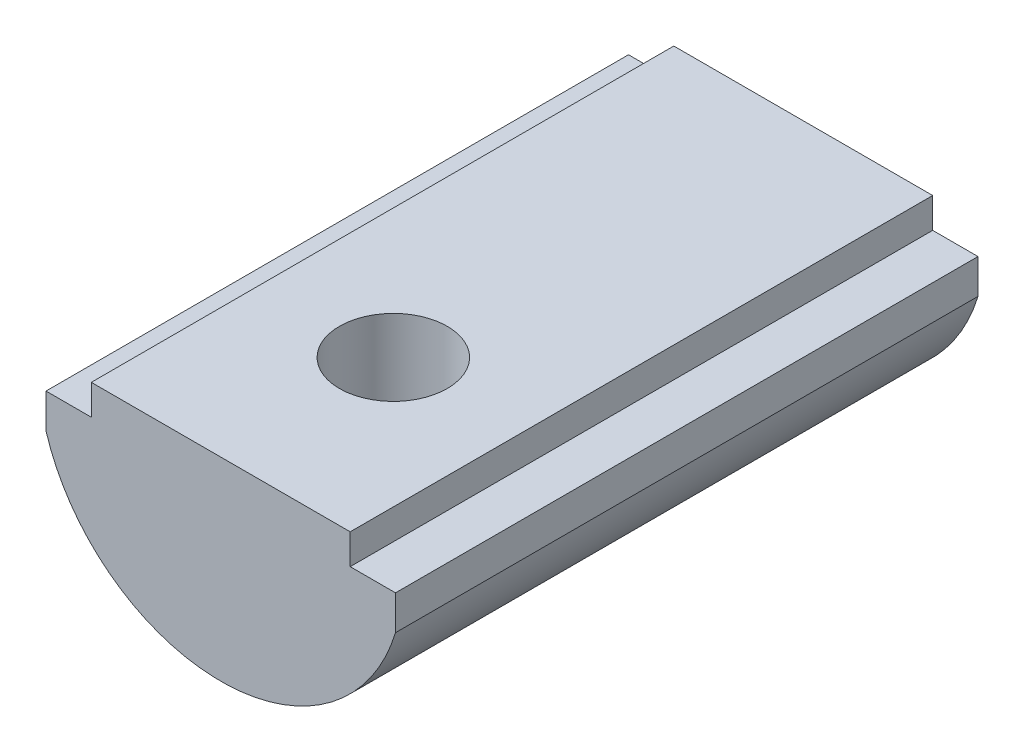
ISO-10303-21;
HEADER;
FILE_DESCRIPTION(('STEP AP214'),'2;1');
FILE_NAME('part.step','',(''),(''),'','','');
FILE_SCHEMA(('AUTOMOTIVE_DESIGN { 1 0 10303 214 1 1 1 1 }'));
ENDSEC;
DATA;
#1=APPLICATION_CONTEXT('core data for automotive mechanical design processes');
#2=APPLICATION_PROTOCOL_DEFINITION('international standard','automotive_design',2000,#1);
#3=PRODUCT_CONTEXT('',#1,'mechanical');
#4=PRODUCT('Part','Part','',(#3));
#5=PRODUCT_RELATED_PRODUCT_CATEGORY('part','',(#4));
#6=PRODUCT_DEFINITION_FORMATION('','',#4);
#7=PRODUCT_DEFINITION_CONTEXT('part definition',#1,'design');
#8=PRODUCT_DEFINITION('design','',#6,#7);
#9=PRODUCT_DEFINITION_SHAPE('','',#8);
#10=(LENGTH_UNIT() NAMED_UNIT(*) SI_UNIT(.MILLI.,.METRE.));
#11=(NAMED_UNIT(*) PLANE_ANGLE_UNIT() SI_UNIT($,.RADIAN.));
#12=(NAMED_UNIT(*) SI_UNIT($,.STERADIAN.) SOLID_ANGLE_UNIT());
#13=UNCERTAINTY_MEASURE_WITH_UNIT(LENGTH_MEASURE(1.E-05),#10,'distance_accuracy_value','');
#14=(GEOMETRIC_REPRESENTATION_CONTEXT(3) GLOBAL_UNCERTAINTY_ASSIGNED_CONTEXT((#13)) GLOBAL_UNIT_ASSIGNED_CONTEXT((#10,
#11,#12)) REPRESENTATION_CONTEXT('',''));
#15=CARTESIAN_POINT('',(0.,0.,0.));
#16=DIRECTION('',(0.,0.,1.));
#17=DIRECTION('',(1.,0.,0.));
#18=AXIS2_PLACEMENT_3D('',#15,#16,#17);
#19=CARTESIAN_POINT('',(0.,-0.26625,13.5));
#20=DIRECTION('',(0.,0.,-1.));
#21=DIRECTION('',(-1.,0.,0.));
#22=AXIS2_PLACEMENT_3D('',#19,#20,#21);
#23=CYLINDRICAL_SURFACE('',#22,4.23375);
#24=CARTESIAN_POINT('',(0.,-4.5,10.75));
#25=CARTESIAN_POINT('',(0.0686237864118017,-4.49999932843915,10.749999035409));
#26=CARTESIAN_POINT('',(0.137257356812151,-4.498315520238,10.7443301596177));
#27=CARTESIAN_POINT('',(0.272529000804914,-4.49176282083563,10.7218561964966));
#28=CARTESIAN_POINT('',(0.339166418101879,-4.48689289386501,10.7050474877162));
#29=CARTESIAN_POINT('',(0.468474920058794,-4.47450215340091,10.6609016825441));
#30=CARTESIAN_POINT('',(0.531151596189107,-4.46698518008461,10.6335798326962));
#31=CARTESIAN_POINT('',(0.651034072623726,-4.4500835802048,10.5692449549359));
#32=CARTESIAN_POINT('',(0.708239195494869,-4.44069872282052,10.5322307291251));
#33=CARTESIAN_POINT('',(0.817150561704415,-4.4207714650654,10.448473435021));
#34=CARTESIAN_POINT('',(0.868682580112705,-4.4102059095374,10.4015093386426));
#35=CARTESIAN_POINT('',(0.963265574582626,-4.38924771380308,10.2996567199359));
#36=CARTESIAN_POINT('',(1.00631517731041,-4.37885510184591,10.2447669168957));
#37=CARTESIAN_POINT('',(1.08361795630315,-4.35917575799818,10.1271593552149));
#38=CARTESIAN_POINT('',(1.11766031333833,-4.34991786860212,10.0642977480577));
#39=CARTESIAN_POINT('',(1.17462019568141,-4.33390143094966,9.93342469298701));
#40=CARTESIAN_POINT('',(1.19754029778309,-4.3271423038688,9.86541444213142));
#41=CARTESIAN_POINT('',(1.23098024824072,-4.31712965248898,9.72812727860656));
#42=CARTESIAN_POINT('',(1.24182053028363,-4.31378574720935,9.65893518215592));
#43=CARTESIAN_POINT('',(1.2517935061444,-4.31071309647505,9.51963983974222));
#44=CARTESIAN_POINT('',(1.25092893662432,-4.31098350597246,9.44953681058977));
#45=CARTESIAN_POINT('',(1.23776883767868,-4.31502870999167,9.31299923200194));
#46=CARTESIAN_POINT('',(1.22587264183316,-4.31868107446438,9.24652196870758));
#47=CARTESIAN_POINT('',(1.19163133306485,-4.32888089641455,9.11655218662936));
#48=CARTESIAN_POINT('',(1.16928521820028,-4.33542863149786,9.05305995469388));
#49=CARTESIAN_POINT('',(1.11447968794132,-4.35078059355042,8.92987629049184));
#50=CARTESIAN_POINT('',(1.08188921608281,-4.35961378352539,8.87024692993989));
#51=CARTESIAN_POINT('',(1.00761122458868,-4.37852721261835,8.75716867939633));
#52=CARTESIAN_POINT('',(0.965921560264357,-4.38860774549331,8.70372125104384));
#53=CARTESIAN_POINT('',(0.872636566111879,-4.40937853473829,8.60225650441008));
#54=CARTESIAN_POINT('',(0.820709229235453,-4.42007697520154,8.55454559212936));
#55=CARTESIAN_POINT('',(0.709457509226966,-4.44051680443162,8.46843904310636));
#56=CARTESIAN_POINT('',(0.650132689544691,-4.45025813665559,8.43004395651637));
#57=CARTESIAN_POINT('',(0.52522550899467,-4.46777043609173,8.36348073640619));
#58=CARTESIAN_POINT('',(0.459606007936522,-4.4755285759071,8.33537869712545));
#59=CARTESIAN_POINT('',(0.32429029457315,-4.48810793360525,8.29069910771513));
#60=CARTESIAN_POINT('',(0.254595187748941,-4.49292994388092,8.27411844806321));
#61=CARTESIAN_POINT('',(0.115712966089499,-4.49896921472746,8.2534580421296));
#62=CARTESIAN_POINT('',(0.0465927692812457,-4.500306225802,8.24896284110323));
#63=CARTESIAN_POINT('',(-0.0914179322819434,-4.49957512590429,8.25143905018159));
#64=CARTESIAN_POINT('',(-0.16030846549679,-4.49750745384695,8.25840898225794));
#65=CARTESIAN_POINT('',(-0.294348943973959,-4.4902775709579,8.28328086684335));
#66=CARTESIAN_POINT('',(-0.359547660620922,-4.48518365786431,8.3009417034825));
#67=CARTESIAN_POINT('',(-0.48604370909631,-4.47248883217657,8.34640548833658));
#68=CARTESIAN_POINT('',(-0.547340576513192,-4.4648876218184,8.37420964120284));
#69=CARTESIAN_POINT('',(-0.665834441829467,-4.44775346112634,8.43987894739764));
#70=CARTESIAN_POINT('',(-0.722907153190926,-4.43818066159394,8.47795768984257));
#71=CARTESIAN_POINT('',(-0.829994812325879,-4.41820375244982,8.56283443794093));
#72=CARTESIAN_POINT('',(-0.880008040572068,-4.40779944126427,8.60963456150293));
#73=CARTESIAN_POINT('',(-0.973375058434738,-4.38687523126746,8.71257619580773));
#74=CARTESIAN_POINT('',(-1.01643353927651,-4.37636409026264,8.76898789867381));
#75=CARTESIAN_POINT('',(-1.09249154921222,-4.35680607882031,8.88846416132494));
#76=CARTESIAN_POINT('',(-1.12549137437872,-4.34775916528753,8.95152852521798));
#77=CARTESIAN_POINT('',(-1.18026375451395,-4.33225883121062,9.08229683913408));
#78=CARTESIAN_POINT('',(-1.20209132476922,-4.32579273738032,9.14997615774635));
#79=CARTESIAN_POINT('',(-1.23397892297454,-4.31621514061561,9.2882750100465));
#80=CARTESIAN_POINT('',(-1.24404282340088,-4.313102533775,9.35889356823545));
#81=CARTESIAN_POINT('',(-1.25185985902064,-4.3106907002059,9.49800542893174));
#82=CARTESIAN_POINT('',(-1.2500933099609,-4.31124268318115,9.56646952176579));
#83=CARTESIAN_POINT('',(-1.23544129004311,-4.31574148975151,9.70207796420856));
#84=CARTESIAN_POINT('',(-1.22255623865074,-4.31968818527493,9.76922236350738));
#85=CARTESIAN_POINT('',(-1.18633860580818,-4.33043351321262,9.89952737127717));
#86=CARTESIAN_POINT('',(-1.16312940928359,-4.33719840615949,9.96272526043613));
#87=CARTESIAN_POINT('',(-1.10701809478574,-4.35281264573967,10.0843804221665));
#88=CARTESIAN_POINT('',(-1.07411416737176,-4.36166238142966,10.1428368071759));
#89=CARTESIAN_POINT('',(-0.998182435907717,-4.38084033420162,10.2555881540747));
#90=CARTESIAN_POINT('',(-0.954837405962773,-4.39120980753771,10.3096624669878));
#91=CARTESIAN_POINT('',(-0.859829647185567,-4.41205434907035,10.4099257066571));
#92=CARTESIAN_POINT('',(-0.808164783563545,-4.42252944371992,10.4561126032936));
#93=CARTESIAN_POINT('',(-0.69624064006889,-4.44275657135613,10.5405766580756));
#94=CARTESIAN_POINT('',(-0.635781189425002,-4.45248013870544,10.578596073418));
#95=CARTESIAN_POINT('',(-0.509041169623608,-4.46977182601122,10.643875922157));
#96=CARTESIAN_POINT('',(-0.442763499792411,-4.4773410116476,10.6711416775098));
#97=CARTESIAN_POINT('',(-0.314177444004065,-4.48876190760684,10.7115265782584));
#98=CARTESIAN_POINT('',(-0.25229471627362,-4.49294200278872,10.7259158903901));
#99=CARTESIAN_POINT('',(-0.126943950948235,-4.49856114675947,10.7451523065063));
#100=CARTESIAN_POINT('',(-0.06347616107576,-4.50000062118555,10.7500008922349));
#101=CARTESIAN_POINT('',(0.,-4.5,10.75));
#102=B_SPLINE_CURVE_WITH_KNOTS('',3,(#24,#25,#26,#27,#28,#29,#30,#31,#32,#33,#34,#35,#36,#37,
#38,#39,#40,#41,#42,#43,#44,#45,#46,#47,#48,#49,#50,#51,#52,#53,#54,#55,#56,#57,#58,#59,#60,#61,
#62,#63,#64,#65,#66,#67,#68,#69,#70,#71,#72,#73,#74,#75,#76,#77,#78,#79,#80,#81,#82,#83,#84,#85,
#86,#87,#88,#89,#90,#91,#92,#93,#94,#95,#96,#97,#98,#99,#100,#101),.UNSPECIFIED.,.T.,.F.,(4,2,2,
2,2,2,2,2,2,2,2,2,2,2,2,2,2,2,2,2,2,2,2,2,2,2,2,2,2,2,2,2,2,2,2,2,2,2,4),(0.,0.205638254271882,
0.411343392339076,0.616751326802564,0.822184659997751,1.03277837596274,1.24340615984796,
1.45859795253036,1.67373986594568,1.88302791331168,2.09226702876575,2.2942157162769,
2.49618377066799,2.70084866061621,2.90556184247695,3.11854112735048,3.33153298679784,
3.54586948946713,3.760148122046,3.96696036252579,4.17374594388141,4.37603306990149,
4.5783442279859,4.78523708127839,4.99218024225705,5.20638600290223,5.42058545787642,
5.63371973469874,5.84678383018345,6.05125150034767,6.2557114569355,6.4577909310943,
6.65990814562037,6.86918224274978,7.07851012342411,7.29370037330861,7.50878399210424,
7.69902640446177,7.88923926845575),.UNSPECIFIED.);
#103=CARTESIAN_POINT('',(0.,-4.5,10.75));
#104=VERTEX_POINT('',#103);
#105=EDGE_CURVE('E48',#104,#104,#102,.T.);
#106=ORIENTED_EDGE('',*,*,#105,.T.);
#107=EDGE_LOOP('',(#106));
#108=FACE_BOUND('',#107,.T.);
#109=CARTESIAN_POINT('',(0.,-0.26625,0.));
#110=DIRECTION('',(0.,0.,1.));
#111=DIRECTION('',(-1.,0.,0.));
#112=AXIS2_PLACEMENT_3D('',#109,#110,#111);
#113=CIRCLE('',#112,4.23375);
#114=CARTESIAN_POINT('',(-4.05,-1.5,0.));
#115=VERTEX_POINT('',#114);
#116=CARTESIAN_POINT('',(4.05,-1.5,0.));
#117=VERTEX_POINT('',#116);
#118=EDGE_CURVE('E137',#115,#117,#113,.T.);
#119=ORIENTED_EDGE('',*,*,#118,.T.);
#120=DIRECTION('',(0.,0.,-1.));
#121=VECTOR('',#120,1.);
#122=CARTESIAN_POINT('',(4.05,-1.5,13.5));
#123=LINE('',#122,#121);
#124=CARTESIAN_POINT('',(4.05,-1.5,13.5));
#125=VERTEX_POINT('',#124);
#126=EDGE_CURVE('E165',#125,#117,#123,.T.);
#127=ORIENTED_EDGE('',*,*,#126,.F.);
#128=CARTESIAN_POINT('',(0.,-0.26625,13.5));
#129=DIRECTION('',(0.,0.,1.));
#130=DIRECTION('',(-1.,0.,0.));
#131=AXIS2_PLACEMENT_3D('',#128,#129,#130);
#132=CIRCLE('',#131,4.23375);
#133=CARTESIAN_POINT('',(-4.05,-1.5,13.5));
#134=VERTEX_POINT('',#133);
#135=EDGE_CURVE('E152',#134,#125,#132,.T.);
#136=ORIENTED_EDGE('',*,*,#135,.F.);
#137=DIRECTION('',(0.,0.,-1.));
#138=VECTOR('',#137,1.);
#139=CARTESIAN_POINT('',(-4.05,-1.5,13.5));
#140=LINE('',#139,#138);
#141=EDGE_CURVE('E133',#134,#115,#140,.T.);
#142=ORIENTED_EDGE('',*,*,#141,.T.);
#143=EDGE_LOOP('',(#119,#127,#136,#142));
#144=FACE_BOUND('',#143,.T.);
#145=CARTESIAN_POINT('',(0.996713774045281,-4.38100402850945,3.));
#146=CARTESIAN_POINT('',(0.996712256752049,-4.38100502492075,3.05389699112058));
#147=CARTESIAN_POINT('',(0.992240519686743,-4.38209547185538,3.10781290657288));
#148=CARTESIAN_POINT('',(0.974481834245944,-4.38633552768121,3.21410973036058));
#149=CARTESIAN_POINT('',(0.961189556857812,-4.3894863813698,3.2664896907459));
#150=CARTESIAN_POINT('',(0.926203139761991,-4.39748544081629,3.36816797296027));
#151=CARTESIAN_POINT('',(0.904516926429583,-4.40233204486734,3.4174691512219));
#152=CARTESIAN_POINT('',(0.853373599866137,-4.41318534912819,3.5117095996548));
#153=CARTESIAN_POINT('',(0.823916817861096,-4.41919199988726,3.55664905563592));
#154=CARTESIAN_POINT('',(0.757609395693494,-4.43180132515102,3.64159036235709));
#155=CARTESIAN_POINT('',(0.720664668480288,-4.43841092748145,3.68151770200756));
#156=CARTESIAN_POINT('',(0.640658825691905,-4.45144239731613,3.75472162153222));
#157=CARTESIAN_POINT('',(0.597597035037312,-4.45786424400521,3.78799746637014));
#158=CARTESIAN_POINT('',(0.505576691001086,-4.469965692347,3.84770926804535));
#159=CARTESIAN_POINT('',(0.456514436333497,-4.47562715580657,3.87398920131831));
#160=CARTESIAN_POINT('',(0.354600304371904,-4.48543435418492,3.91814010895125));
#161=CARTESIAN_POINT('',(0.301748229533913,-4.4895800100236,3.93601064460452));
#162=CARTESIAN_POINT('',(0.193282939509225,-4.49593723558409,3.96302089751822));
#163=CARTESIAN_POINT('',(0.137650662341284,-4.49813269408634,3.97208794233194));
#164=CARTESIAN_POINT('',(0.0256097198781452,-4.50029326221743,3.98101287632863));
#165=CARTESIAN_POINT('',(-0.0307989475674667,-4.5002583656675,3.98087073999923));
#166=CARTESIAN_POINT('',(-0.142781205265272,-4.49796228767712,3.97138186709138));
#167=CARTESIAN_POINT('',(-0.198354932679156,-4.4957014760553,3.96203665953221));
#168=CARTESIAN_POINT('',(-0.307101536500225,-4.48919877523535,3.9343719347727));
#169=CARTESIAN_POINT('',(-0.360274373207623,-4.48495685329182,3.91605226923505));
#170=CARTESIAN_POINT('',(-0.462735896825075,-4.47495142849912,3.87087809446573));
#171=CARTESIAN_POINT('',(-0.51202288653758,-4.46918726551855,3.84401988139555));
#172=CARTESIAN_POINT('',(-0.605288867962651,-4.45677272988248,3.78243778023186));
#173=CARTESIAN_POINT('',(-0.649267799627562,-4.45012234720336,3.74771380316929));
#174=CARTESIAN_POINT('',(-0.730561926214944,-4.43669546874781,3.67137234078111));
#175=CARTESIAN_POINT('',(-0.767891852684348,-4.42991928944726,3.62977049888311));
#176=CARTESIAN_POINT('',(-0.834911913119816,-4.41700049434661,3.54072115393589));
#177=CARTESIAN_POINT('',(-0.86460264719404,-4.41085782880261,3.49327411049848));
#178=CARTESIAN_POINT('',(-0.915065646867823,-4.40000777457676,3.39459814674525));
#179=CARTESIAN_POINT('',(-0.935963826332135,-4.39528042318698,3.34343586470598));
#180=CARTESIAN_POINT('',(-0.968828605839573,-4.38769362666553,3.2381879764742));
#181=CARTESIAN_POINT('',(-0.980796557178201,-4.3848338989388,3.18410281389206));
#182=CARTESIAN_POINT('',(-0.995258702501088,-4.38136283282423,3.07586991088252));
#183=CARTESIAN_POINT('',(-0.997962798304883,-4.38070168891998,3.02175174730674));
#184=CARTESIAN_POINT('',(-0.994402751292175,-4.38156354315097,2.91383150408809));
#185=CARTESIAN_POINT('',(-0.988139273396978,-4.38308637935001,2.86002940130716));
#186=CARTESIAN_POINT('',(-0.96694673595045,-4.38811467128409,2.75483530808954));
#187=CARTESIAN_POINT('',(-0.952106845974153,-4.39159971632518,2.70342431283568));
#188=CARTESIAN_POINT('',(-0.914267088965298,-4.40014992207137,2.60384167344066));
#189=CARTESIAN_POINT('',(-0.891266798955244,-4.40521516468112,2.55567019736727));
#190=CARTESIAN_POINT('',(-0.837418622526385,-4.41644661468188,2.46325222152052));
#191=CARTESIAN_POINT('',(-0.806475346499283,-4.42262591168737,2.41906293831705));
#192=CARTESIAN_POINT('',(-0.737752747305828,-4.43537202211561,2.33643046835112));
#193=CARTESIAN_POINT('',(-0.699972641862162,-4.44193887982547,2.2979879400586));
#194=CARTESIAN_POINT('',(-0.617677893768889,-4.45491130522523,2.22699392403255));
#195=CARTESIAN_POINT('',(-0.573030490559106,-4.46130988673398,2.19459499115833));
#196=CARTESIAN_POINT('',(-0.478892995968475,-4.47309544652259,2.1375830602711));
#197=CARTESIAN_POINT('',(-0.429402530407572,-4.47848234654487,2.11297066447689));
#198=CARTESIAN_POINT('',(-0.326229904061679,-4.48773428954018,2.07184186061798));
#199=CARTESIAN_POINT('',(-0.27249935492223,-4.49157732396257,2.05544176478266));
#200=CARTESIAN_POINT('',(-0.162975177332948,-4.49721726538817,2.03165449967298));
#201=CARTESIAN_POINT('',(-0.107181515690195,-4.49901413945638,2.02426747547281));
#202=CARTESIAN_POINT('',(0.00499916490925216,-4.50036929110753,2.01868074858725));
#203=CARTESIAN_POINT('',(0.0613871182392231,-4.49992325919172,2.02049873236513));
#204=CARTESIAN_POINT('',(0.173047667862059,-4.4968307883377,2.03331870689214));
#205=CARTESIAN_POINT('',(0.228320255785168,-4.49418433289371,2.0443207665328));
#206=CARTESIAN_POINT('',(0.336166798451702,-4.48697891136392,2.07523541695417));
#207=CARTESIAN_POINT('',(0.388741501965219,-4.48242047918501,2.09514552032586));
#208=CARTESIAN_POINT('',(0.489721409765448,-4.47188806551393,2.14338680504448));
#209=CARTESIAN_POINT('',(0.538126594538948,-4.4659140773975,2.17171802579919));
#210=CARTESIAN_POINT('',(0.629395307181066,-4.45320913217786,2.23609700186397));
#211=CARTESIAN_POINT('',(0.672258507806282,-4.44647813041831,2.27214521251383));
#212=CARTESIAN_POINT('',(0.751209049091737,-4.43301512259578,2.35103830154088));
#213=CARTESIAN_POINT('',(0.787295771470537,-4.42628311649719,2.3938837994408));
#214=CARTESIAN_POINT('',(0.851336512037371,-4.4136497307053,2.48481486162436));
#215=CARTESIAN_POINT('',(0.879358836487203,-4.40774160719413,2.5328513684301));
#216=CARTESIAN_POINT('',(0.92682617132969,-4.39737901508484,2.63310951151991));
#217=CARTESIAN_POINT('',(0.946277858050916,-4.39292341571034,2.68532785264381));
#218=CARTESIAN_POINT('',(0.972926296118792,-4.38671081483529,2.78126871655182));
#219=CARTESIAN_POINT('',(0.981829686152931,-4.38458544055248,2.82450182814068));
#220=CARTESIAN_POINT('',(0.993723897969256,-4.38173167470606,2.91181909896143));
#221=CARTESIAN_POINT('',(0.996715015445798,-4.38100321327778,2.95590321552009));
#222=CARTESIAN_POINT('',(0.996713774045281,-4.38100402850945,3.));
#223=B_SPLINE_CURVE_WITH_KNOTS('',3,(#145,#146,#147,#148,#149,#150,#151,#152,#153,#154,#155,
#156,#157,#158,#159,#160,#161,#162,#163,#164,#165,#166,#167,#168,#169,#170,#171,#172,#173,#174,
#175,#176,#177,#178,#179,#180,#181,#182,#183,#184,#185,#186,#187,#188,#189,#190,#191,#192,#193,
#194,#195,#196,#197,#198,#199,#200,#201,#202,#203,#204,#205,#206,#207,#208,#209,#210,#211,#212,
#213,#214,#215,#216,#217,#218,#219,#220,#221,#222),.UNSPECIFIED.,.T.,.F.,(4,2,2,2,2,2,2,2,2,2,2,
2,2,2,2,2,2,2,2,2,2,2,2,2,2,2,2,2,2,2,2,2,2,2,2,2,2,2,4),(0.,0.161529886648151,
0.323157452059853,0.484632763808414,0.64610119366925,0.809740602572905,0.973398084780012,
1.14044685173976,1.30750433243786,1.47592942809807,1.64435499034933,1.81275257471318,
1.98115294258643,2.14962645882287,2.31810188074526,2.48619925478504,2.65428341965013,
2.81987107280707,2.98543366464995,3.14721917491318,3.30899268984014,3.46911374188114,
3.62924309467922,3.7913936339915,3.95356273848602,4.1193922391383,4.28523456208162,
4.45336362696847,4.62149539802128,4.78995033919144,4.95840654398592,5.12681573978072,
5.29522572368221,5.46364564732913,5.63208093004131,5.79904446994931,5.96587771818353,
6.098042885886,6.23020144335819),.UNSPECIFIED.);
#224=CARTESIAN_POINT('',(0.996713774045281,-4.38100402850945,3.));
#225=VERTEX_POINT('',#224);
#226=EDGE_CURVE('E11',#225,#225,#223,.T.);
#227=ORIENTED_EDGE('',*,*,#226,.F.);
#228=EDGE_LOOP('',(#227));
#229=FACE_BOUND('',#228,.T.);
#230=ADVANCED_FACE('F35',(#108,#144,#229),#23,.T.);
#231=CARTESIAN_POINT('',(4.05,-0.699999999999999,13.5));
#232=DIRECTION('',(-1.,0.,0.));
#233=DIRECTION('',(0.,0.,1.));
#234=AXIS2_PLACEMENT_3D('',#231,#232,#233);
#235=PLANE('',#234);
#236=DIRECTION('',(0.,1.,0.));
#237=VECTOR('',#236,1.);
#238=CARTESIAN_POINT('',(4.05,-0.699999999999999,0.));
#239=LINE('',#238,#237);
#240=CARTESIAN_POINT('',(4.05,-0.699999999999999,0.));
#241=VERTEX_POINT('',#240);
#242=EDGE_CURVE('E140',#117,#241,#239,.T.);
#243=ORIENTED_EDGE('',*,*,#242,.T.);
#244=DIRECTION('',(0.,0.,-1.));
#245=VECTOR('',#244,1.);
#246=CARTESIAN_POINT('',(4.05,-0.699999999999999,13.5));
#247=LINE('',#246,#245);
#248=CARTESIAN_POINT('',(4.05,-0.699999999999999,13.5));
#249=VERTEX_POINT('',#248);
#250=EDGE_CURVE('E162',#249,#241,#247,.T.);
#251=ORIENTED_EDGE('',*,*,#250,.F.);
#252=DIRECTION('',(0.,1.,0.));
#253=VECTOR('',#252,1.);
#254=CARTESIAN_POINT('',(4.05,-0.699999999999999,13.5));
#255=LINE('',#254,#253);
#256=EDGE_CURVE('E100',#125,#249,#255,.T.);
#257=ORIENTED_EDGE('',*,*,#256,.F.);
#258=ORIENTED_EDGE('',*,*,#126,.T.);
#259=EDGE_LOOP('',(#243,#251,#257,#258));
#260=FACE_BOUND('',#259,.T.);
#261=ADVANCED_FACE('F201',(#260),#235,.F.);
#262=CARTESIAN_POINT('',(3.,-0.699999999999999,13.5));
#263=DIRECTION('',(0.,-1.,0.));
#264=DIRECTION('',(0.,0.,-1.));
#265=AXIS2_PLACEMENT_3D('',#262,#263,#264);
#266=PLANE('',#265);
#267=DIRECTION('',(-1.,0.,0.));
#268=VECTOR('',#267,1.);
#269=CARTESIAN_POINT('',(3.,-0.699999999999999,0.));
#270=LINE('',#269,#268);
#271=CARTESIAN_POINT('',(3.,-0.699999999999999,0.));
#272=VERTEX_POINT('',#271);
#273=EDGE_CURVE('E143',#241,#272,#270,.T.);
#274=ORIENTED_EDGE('',*,*,#273,.T.);
#275=DIRECTION('',(0.,0.,-1.));
#276=VECTOR('',#275,1.);
#277=CARTESIAN_POINT('',(3.,-0.699999999999999,13.5));
#278=LINE('',#277,#276);
#279=CARTESIAN_POINT('',(3.,-0.699999999999999,13.5));
#280=VERTEX_POINT('',#279);
#281=EDGE_CURVE('E159',#280,#272,#278,.T.);
#282=ORIENTED_EDGE('',*,*,#281,.F.);
#283=DIRECTION('',(-1.,0.,0.));
#284=VECTOR('',#283,1.);
#285=CARTESIAN_POINT('',(3.,-0.699999999999999,13.5));
#286=LINE('',#285,#284);
#287=EDGE_CURVE('E213',#249,#280,#286,.T.);
#288=ORIENTED_EDGE('',*,*,#287,.F.);
#289=ORIENTED_EDGE('',*,*,#250,.T.);
#290=EDGE_LOOP('',(#274,#282,#288,#289));
#291=FACE_BOUND('',#290,.T.);
#292=ADVANCED_FACE('F198',(#291),#266,.F.);
#293=CARTESIAN_POINT('',(3.,0.,13.5));
#294=DIRECTION('',(-1.,0.,0.));
#295=DIRECTION('',(0.,-1.,0.));
#296=AXIS2_PLACEMENT_3D('',#293,#294,#295);
#297=PLANE('',#296);
#298=DIRECTION('',(0.,1.,0.));
#299=VECTOR('',#298,1.);
#300=CARTESIAN_POINT('',(3.,0.,0.));
#301=LINE('',#300,#299);
#302=CARTESIAN_POINT('',(3.,0.,0.));
#303=VERTEX_POINT('',#302);
#304=EDGE_CURVE('E145',#272,#303,#301,.T.);
#305=ORIENTED_EDGE('',*,*,#304,.T.);
#306=DIRECTION('',(0.,0.,-1.));
#307=VECTOR('',#306,1.);
#308=CARTESIAN_POINT('',(3.,0.,13.5));
#309=LINE('',#308,#307);
#310=CARTESIAN_POINT('',(3.,0.,13.5));
#311=VERTEX_POINT('',#310);
#312=EDGE_CURVE('E156',#311,#303,#309,.T.);
#313=ORIENTED_EDGE('',*,*,#312,.F.);
#314=DIRECTION('',(0.,1.,0.));
#315=VECTOR('',#314,1.);
#316=CARTESIAN_POINT('',(3.,0.,13.5));
#317=LINE('',#316,#315);
#318=EDGE_CURVE('E219',#280,#311,#317,.T.);
#319=ORIENTED_EDGE('',*,*,#318,.F.);
#320=ORIENTED_EDGE('',*,*,#281,.T.);
#321=EDGE_LOOP('',(#305,#313,#319,#320));
#322=FACE_BOUND('',#321,.T.);
#323=ADVANCED_FACE('F194',(#322),#297,.F.);
#324=CARTESIAN_POINT('',(-3.,0.,13.5));
#325=DIRECTION('',(0.,-1.,0.));
#326=DIRECTION('',(1.,0.,0.));
#327=AXIS2_PLACEMENT_3D('',#324,#325,#326);
#328=PLANE('',#327);
#329=CARTESIAN_POINT('',(0.,0.,9.5));
#330=DIRECTION('',(0.,1.,0.));
#331=DIRECTION('',(0.,0.,1.));
#332=AXIS2_PLACEMENT_3D('',#329,#330,#331);
#333=CIRCLE('',#332,1.25);
#334=CARTESIAN_POINT('',(0.,0.,10.75));
#335=VERTEX_POINT('',#334);
#336=EDGE_CURVE('E141',#335,#335,#333,.T.);
#337=ORIENTED_EDGE('',*,*,#336,.F.);
#338=EDGE_LOOP('',(#337));
#339=FACE_BOUND('',#338,.T.);
#340=DIRECTION('',(-1.,0.,0.));
#341=VECTOR('',#340,1.);
#342=CARTESIAN_POINT('',(-3.,0.,0.));
#343=LINE('',#342,#341);
#344=CARTESIAN_POINT('',(-3.,0.,0.));
#345=VERTEX_POINT('',#344);
#346=EDGE_CURVE('E147',#303,#345,#343,.T.);
#347=ORIENTED_EDGE('',*,*,#346,.T.);
#348=DIRECTION('',(0.,0.,-1.));
#349=VECTOR('',#348,1.);
#350=CARTESIAN_POINT('',(-3.,0.,13.5));
#351=LINE('',#350,#349);
#352=CARTESIAN_POINT('',(-3.,0.,13.5));
#353=VERTEX_POINT('',#352);
#354=EDGE_CURVE('E128',#353,#345,#351,.T.);
#355=ORIENTED_EDGE('',*,*,#354,.F.);
#356=DIRECTION('',(-1.,0.,0.));
#357=VECTOR('',#356,1.);
#358=CARTESIAN_POINT('',(-3.,0.,13.5));
#359=LINE('',#358,#357);
#360=EDGE_CURVE('E119',#311,#353,#359,.T.);
#361=ORIENTED_EDGE('',*,*,#360,.F.);
#362=ORIENTED_EDGE('',*,*,#312,.T.);
#363=EDGE_LOOP('',(#347,#355,#361,#362));
#364=FACE_BOUND('',#363,.T.);
#365=ADVANCED_FACE('F191',(#339,#364),#328,.F.);
#366=CARTESIAN_POINT('',(-3.,0.,13.5));
#367=DIRECTION('',(1.,0.,0.));
#368=DIRECTION('',(0.,1.,0.));
#369=AXIS2_PLACEMENT_3D('',#366,#367,#368);
#370=PLANE('',#369);
#371=DIRECTION('',(0.,-1.,0.));
#372=VECTOR('',#371,1.);
#373=CARTESIAN_POINT('',(-3.,0.,0.));
#374=LINE('',#373,#372);
#375=CARTESIAN_POINT('',(-3.,-0.7,0.));
#376=VERTEX_POINT('',#375);
#377=EDGE_CURVE('E127',#345,#376,#374,.T.);
#378=ORIENTED_EDGE('',*,*,#377,.T.);
#379=DIRECTION('',(0.,0.,-1.));
#380=VECTOR('',#379,1.);
#381=CARTESIAN_POINT('',(-3.,-0.7,13.5));
#382=LINE('',#381,#380);
#383=CARTESIAN_POINT('',(-3.,-0.7,13.5));
#384=VERTEX_POINT('',#383);
#385=EDGE_CURVE('E124',#384,#376,#382,.T.);
#386=ORIENTED_EDGE('',*,*,#385,.F.);
#387=DIRECTION('',(0.,-1.,0.));
#388=VECTOR('',#387,1.);
#389=CARTESIAN_POINT('',(-3.,0.,13.5));
#390=LINE('',#389,#388);
#391=EDGE_CURVE('E113',#353,#384,#390,.T.);
#392=ORIENTED_EDGE('',*,*,#391,.F.);
#393=ORIENTED_EDGE('',*,*,#354,.T.);
#394=EDGE_LOOP('',(#378,#386,#392,#393));
#395=FACE_BOUND('',#394,.T.);
#396=ADVANCED_FACE('F125',(#395),#370,.F.);
#397=CARTESIAN_POINT('',(-3.,-0.7,13.5));
#398=DIRECTION('',(0.,-1.,0.));
#399=DIRECTION('',(1.,0.,0.));
#400=AXIS2_PLACEMENT_3D('',#397,#398,#399);
#401=PLANE('',#400);
#402=DIRECTION('',(-1.,0.,0.));
#403=VECTOR('',#402,1.);
#404=CARTESIAN_POINT('',(-3.,-0.7,0.));
#405=LINE('',#404,#403);
#406=CARTESIAN_POINT('',(-4.05,-0.7,0.));
#407=VERTEX_POINT('',#406);
#408=EDGE_CURVE('E85',#376,#407,#405,.T.);
#409=ORIENTED_EDGE('',*,*,#408,.T.);
#410=DIRECTION('',(0.,0.,-1.));
#411=VECTOR('',#410,1.);
#412=CARTESIAN_POINT('',(-4.05,-0.7,13.5));
#413=LINE('',#412,#411);
#414=CARTESIAN_POINT('',(-4.05,-0.7,13.5));
#415=VERTEX_POINT('',#414);
#416=EDGE_CURVE('E129',#415,#407,#413,.T.);
#417=ORIENTED_EDGE('',*,*,#416,.F.);
#418=DIRECTION('',(-1.,0.,0.));
#419=VECTOR('',#418,1.);
#420=CARTESIAN_POINT('',(-3.,-0.7,13.5));
#421=LINE('',#420,#419);
#422=EDGE_CURVE('E117',#384,#415,#421,.T.);
#423=ORIENTED_EDGE('',*,*,#422,.F.);
#424=ORIENTED_EDGE('',*,*,#385,.T.);
#425=EDGE_LOOP('',(#409,#417,#423,#424));
#426=FACE_BOUND('',#425,.T.);
#427=ADVANCED_FACE('F131',(#426),#401,.F.);
#428=CARTESIAN_POINT('',(-4.05,-0.7,13.5));
#429=DIRECTION('',(1.,0.,0.));
#430=DIRECTION('',(0.,0.,-1.));
#431=AXIS2_PLACEMENT_3D('',#428,#429,#430);
#432=PLANE('',#431);
#433=DIRECTION('',(0.,-1.,0.));
#434=VECTOR('',#433,1.);
#435=CARTESIAN_POINT('',(-4.05,-0.7,0.));
#436=LINE('',#435,#434);
#437=EDGE_CURVE('E91',#407,#115,#436,.T.);
#438=ORIENTED_EDGE('',*,*,#437,.T.);
#439=ORIENTED_EDGE('',*,*,#141,.F.);
#440=DIRECTION('',(0.,-1.,0.));
#441=VECTOR('',#440,1.);
#442=CARTESIAN_POINT('',(-4.05,-0.7,13.5));
#443=LINE('',#442,#441);
#444=EDGE_CURVE('E56',#415,#134,#443,.T.);
#445=ORIENTED_EDGE('',*,*,#444,.F.);
#446=ORIENTED_EDGE('',*,*,#416,.T.);
#447=EDGE_LOOP('',(#438,#439,#445,#446));
#448=FACE_BOUND('',#447,.T.);
#449=ADVANCED_FACE('F181',(#448),#432,.F.);
#450=CARTESIAN_POINT('',(0.,-0.26625,13.5));
#451=DIRECTION('',(0.,0.,-1.));
#452=DIRECTION('',(-1.,0.,0.));
#453=AXIS2_PLACEMENT_3D('',#450,#451,#452);
#454=PLANE('',#453);
#455=ORIENTED_EDGE('',*,*,#135,.T.);
#456=ORIENTED_EDGE('',*,*,#256,.T.);
#457=ORIENTED_EDGE('',*,*,#287,.T.);
#458=ORIENTED_EDGE('',*,*,#318,.T.);
#459=ORIENTED_EDGE('',*,*,#360,.T.);
#460=ORIENTED_EDGE('',*,*,#391,.T.);
#461=ORIENTED_EDGE('',*,*,#422,.T.);
#462=ORIENTED_EDGE('',*,*,#444,.T.);
#463=EDGE_LOOP('',(#455,#456,#457,#458,#459,#460,#461,#462));
#464=FACE_BOUND('',#463,.T.);
#465=ADVANCED_FACE('F115',(#464),#454,.F.);
#466=CARTESIAN_POINT('',(0.,-0.26625,0.));
#467=DIRECTION('',(0.,0.,-1.));
#468=DIRECTION('',(-1.,0.,0.));
#469=AXIS2_PLACEMENT_3D('',#466,#467,#468);
#470=PLANE('',#469);
#471=ORIENTED_EDGE('',*,*,#118,.F.);
#472=ORIENTED_EDGE('',*,*,#437,.F.);
#473=ORIENTED_EDGE('',*,*,#408,.F.);
#474=ORIENTED_EDGE('',*,*,#377,.F.);
#475=ORIENTED_EDGE('',*,*,#346,.F.);
#476=ORIENTED_EDGE('',*,*,#304,.F.);
#477=ORIENTED_EDGE('',*,*,#273,.F.);
#478=ORIENTED_EDGE('',*,*,#242,.F.);
#479=EDGE_LOOP('',(#471,#472,#473,#474,#475,#476,#477,#478));
#480=FACE_BOUND('',#479,.T.);
#481=ADVANCED_FACE('F176',(#480),#470,.T.);
#482=CARTESIAN_POINT('',(0.,0.,9.5));
#483=DIRECTION('',(0.,1.,0.));
#484=DIRECTION('',(0.,0.,1.));
#485=AXIS2_PLACEMENT_3D('',#482,#483,#484);
#486=CYLINDRICAL_SURFACE('',#485,1.25);
#487=ORIENTED_EDGE('',*,*,#336,.T.);
#488=EDGE_LOOP('',(#487));
#489=FACE_BOUND('',#488,.T.);
#490=ORIENTED_EDGE('',*,*,#105,.F.);
#491=EDGE_LOOP('',(#490));
#492=FACE_BOUND('',#491,.T.);
#493=ADVANCED_FACE('F171',(#489,#492),#486,.F.);
#494=CARTESIAN_POINT('',(0.,-4.3,3.));
#495=DIRECTION('',(0.,1.,0.));
#496=DIRECTION('',(0.,0.,-1.));
#497=AXIS2_PLACEMENT_3D('',#494,#495,#496);
#498=SPHERICAL_SURFACE('',#497,1.);
#499=ORIENTED_EDGE('',*,*,#226,.T.);
#500=EDGE_LOOP('',(#499));
#501=FACE_BOUND('',#500,.T.);
#502=ADVANCED_FACE('F175',(#501),#498,.T.);
#503=CLOSED_SHELL('',(#230,#261,#292,#323,#365,#396,#427,#449,#465,#481,#493,#502));
#504=MANIFOLD_SOLID_BREP('B2',#503);
#505=ADVANCED_BREP_SHAPE_REPRESENTATION('',(#18,#504),#14);
#506=SHAPE_DEFINITION_REPRESENTATION(#9,#505);
ENDSEC;
END-ISO-10303-21;
